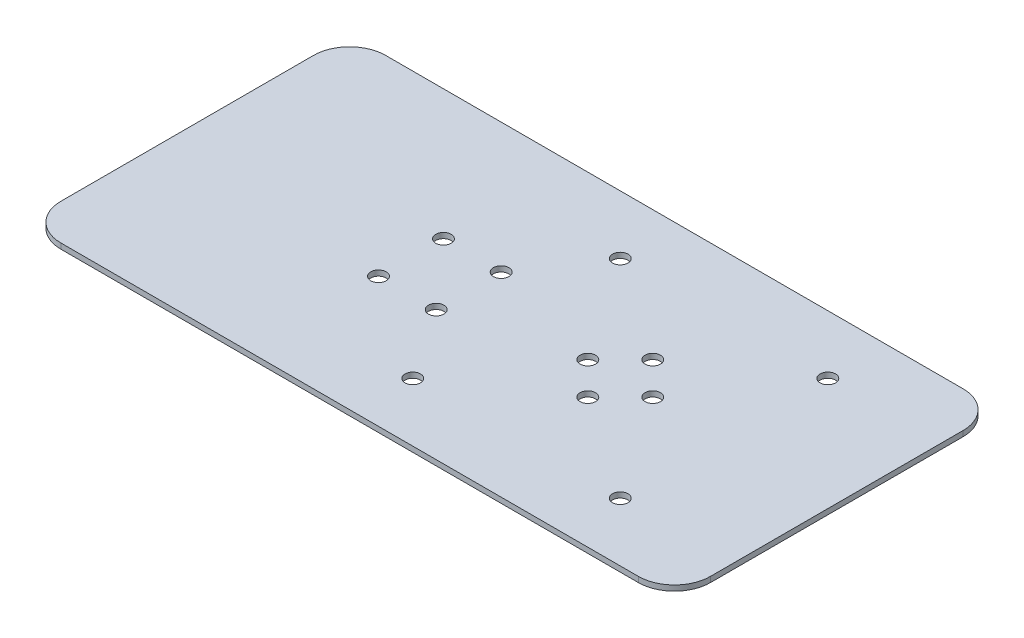
ISO-10303-21;
HEADER;
FILE_DESCRIPTION(('STEP AP214'),'2;1');
FILE_NAME('part.step','',(''),(''),'','','');
FILE_SCHEMA(('AUTOMOTIVE_DESIGN { 1 0 10303 214 1 1 1 1 }'));
ENDSEC;
DATA;
#1=APPLICATION_CONTEXT('core data for automotive mechanical design processes');
#2=APPLICATION_PROTOCOL_DEFINITION('international standard','automotive_design',2000,#1);
#3=PRODUCT_CONTEXT('',#1,'mechanical');
#4=PRODUCT('Part','Part','',(#3));
#5=PRODUCT_RELATED_PRODUCT_CATEGORY('part','',(#4));
#6=PRODUCT_DEFINITION_FORMATION('','',#4);
#7=PRODUCT_DEFINITION_CONTEXT('part definition',#1,'design');
#8=PRODUCT_DEFINITION('design','',#6,#7);
#9=PRODUCT_DEFINITION_SHAPE('','',#8);
#10=(LENGTH_UNIT() NAMED_UNIT(*) SI_UNIT(.MILLI.,.METRE.));
#11=(NAMED_UNIT(*) PLANE_ANGLE_UNIT() SI_UNIT($,.RADIAN.));
#12=(NAMED_UNIT(*) SI_UNIT($,.STERADIAN.) SOLID_ANGLE_UNIT());
#13=UNCERTAINTY_MEASURE_WITH_UNIT(LENGTH_MEASURE(1.E-05),#10,'distance_accuracy_value','');
#14=(GEOMETRIC_REPRESENTATION_CONTEXT(3) GLOBAL_UNCERTAINTY_ASSIGNED_CONTEXT((#13)) GLOBAL_UNIT_ASSIGNED_CONTEXT((#10,
#11,#12)) REPRESENTATION_CONTEXT('',''));
#15=CARTESIAN_POINT('',(0.,0.,0.));
#16=DIRECTION('',(0.,0.,1.));
#17=DIRECTION('',(1.,0.,0.));
#18=AXIS2_PLACEMENT_3D('',#15,#16,#17);
#19=CARTESIAN_POINT('',(0.,1.5,0.));
#20=DIRECTION('',(1.,0.,0.));
#21=DIRECTION('',(0.,0.,-1.));
#22=AXIS2_PLACEMENT_3D('',#19,#20,#21);
#23=PLANE('',#22);
#24=DIRECTION('',(0.,0.,1.));
#25=VECTOR('',#24,1.);
#26=CARTESIAN_POINT('',(0.,1.5,0.));
#27=LINE('',#26,#25);
#28=CARTESIAN_POINT('',(0.,1.5,25.));
#29=VERTEX_POINT('',#28);
#30=CARTESIAN_POINT('',(0.,1.5,95.));
#31=VERTEX_POINT('',#30);
#32=EDGE_CURVE('E249',#29,#31,#27,.T.);
#33=ORIENTED_EDGE('',*,*,#32,.F.);
#34=DIRECTION('',(0.,1.,0.));
#35=VECTOR('',#34,1.);
#36=CARTESIAN_POINT('',(0.,1.5,25.));
#37=LINE('',#36,#35);
#38=CARTESIAN_POINT('',(0.,0.,25.));
#39=VERTEX_POINT('',#38);
#40=EDGE_CURVE('E117',#29,#39,#37,.F.);
#41=ORIENTED_EDGE('',*,*,#40,.T.);
#42=DIRECTION('',(0.,0.,1.));
#43=VECTOR('',#42,1.);
#44=CARTESIAN_POINT('',(0.,0.,0.));
#45=LINE('',#44,#43);
#46=CARTESIAN_POINT('',(0.,0.,95.));
#47=VERTEX_POINT('',#46);
#48=EDGE_CURVE('E245',#39,#47,#45,.T.);
#49=ORIENTED_EDGE('',*,*,#48,.T.);
#50=DIRECTION('',(0.,1.,0.));
#51=VECTOR('',#50,1.);
#52=CARTESIAN_POINT('',(0.,1.5,95.));
#53=LINE('',#52,#51);
#54=EDGE_CURVE('E123',#47,#31,#53,.T.);
#55=ORIENTED_EDGE('',*,*,#54,.T.);
#56=EDGE_LOOP('',(#33,#41,#49,#55));
#57=FACE_BOUND('',#56,.T.);
#58=ADVANCED_FACE('F45',(#57),#23,.F.);
#59=CARTESIAN_POINT('',(180.,1.5,0.));
#60=DIRECTION('',(-1.,0.,0.));
#61=DIRECTION('',(0.,0.,1.));
#62=AXIS2_PLACEMENT_3D('',#59,#60,#61);
#63=PLANE('',#62);
#64=DIRECTION('',(0.,0.,-1.));
#65=VECTOR('',#64,1.);
#66=CARTESIAN_POINT('',(180.,0.,0.));
#67=LINE('',#66,#65);
#68=CARTESIAN_POINT('',(180.,0.,95.));
#69=VERTEX_POINT('',#68);
#70=CARTESIAN_POINT('',(180.,0.,25.));
#71=VERTEX_POINT('',#70);
#72=EDGE_CURVE('E253',#69,#71,#67,.T.);
#73=ORIENTED_EDGE('',*,*,#72,.T.);
#74=DIRECTION('',(0.,1.,0.));
#75=VECTOR('',#74,1.);
#76=CARTESIAN_POINT('',(180.,1.5,25.));
#77=LINE('',#76,#75);
#78=CARTESIAN_POINT('',(180.,1.5,25.));
#79=VERTEX_POINT('',#78);
#80=EDGE_CURVE('E290',#71,#79,#77,.T.);
#81=ORIENTED_EDGE('',*,*,#80,.T.);
#82=DIRECTION('',(0.,0.,-1.));
#83=VECTOR('',#82,1.);
#84=CARTESIAN_POINT('',(180.,1.5,0.));
#85=LINE('',#84,#83);
#86=CARTESIAN_POINT('',(180.,1.5,95.));
#87=VERTEX_POINT('',#86);
#88=EDGE_CURVE('E252',#87,#79,#85,.T.);
#89=ORIENTED_EDGE('',*,*,#88,.F.);
#90=DIRECTION('',(0.,1.,0.));
#91=VECTOR('',#90,1.);
#92=CARTESIAN_POINT('',(180.,1.5,95.));
#93=LINE('',#92,#91);
#94=EDGE_CURVE('E287',#87,#69,#93,.F.);
#95=ORIENTED_EDGE('',*,*,#94,.T.);
#96=EDGE_LOOP('',(#73,#81,#89,#95));
#97=FACE_BOUND('',#96,.T.);
#98=ADVANCED_FACE('F297',(#97),#63,.F.);
#99=CARTESIAN_POINT('',(0.,1.5,0.));
#100=DIRECTION('',(0.,1.,0.));
#101=DIRECTION('',(0.,0.,1.));
#102=AXIS2_PLACEMENT_3D('',#99,#100,#101);
#103=PLANE('',#102);
#104=DIRECTION('',(1.,0.,0.));
#105=VECTOR('',#104,1.);
#106=CARTESIAN_POINT('',(0.,1.5,15.));
#107=LINE('',#106,#105);
#108=CARTESIAN_POINT('',(10.,1.5,15.));
#109=VERTEX_POINT('',#108);
#110=CARTESIAN_POINT('',(170.,1.5,15.));
#111=VERTEX_POINT('',#110);
#112=EDGE_CURVE('E130',#109,#111,#107,.T.);
#113=ORIENTED_EDGE('',*,*,#112,.F.);
#114=CARTESIAN_POINT('',(10.,1.5,25.));
#115=DIRECTION('',(0.,1.,0.));
#116=DIRECTION('',(0.,0.,1.));
#117=AXIS2_PLACEMENT_3D('',#114,#115,#116);
#118=CIRCLE('',#117,10.);
#119=EDGE_CURVE('E112',#109,#29,#118,.T.);
#120=ORIENTED_EDGE('',*,*,#119,.T.);
#121=ORIENTED_EDGE('',*,*,#32,.T.);
#122=CARTESIAN_POINT('',(10.,1.5,95.));
#123=DIRECTION('',(0.,1.,0.));
#124=DIRECTION('',(0.,0.,1.));
#125=AXIS2_PLACEMENT_3D('',#122,#123,#124);
#126=CIRCLE('',#125,10.);
#127=CARTESIAN_POINT('',(10.,1.5,105.));
#128=VERTEX_POINT('',#127);
#129=EDGE_CURVE('E135',#31,#128,#126,.T.);
#130=ORIENTED_EDGE('',*,*,#129,.T.);
#131=DIRECTION('',(-1.,0.,0.));
#132=VECTOR('',#131,1.);
#133=CARTESIAN_POINT('',(0.,1.5,105.));
#134=LINE('',#133,#132);
#135=CARTESIAN_POINT('',(170.,1.5,105.));
#136=VERTEX_POINT('',#135);
#137=EDGE_CURVE('E142',#136,#128,#134,.T.);
#138=ORIENTED_EDGE('',*,*,#137,.F.);
#139=CARTESIAN_POINT('',(170.,1.5,95.));
#140=DIRECTION('',(0.,1.,0.));
#141=DIRECTION('',(0.,0.,1.));
#142=AXIS2_PLACEMENT_3D('',#139,#140,#141);
#143=CIRCLE('',#142,10.);
#144=EDGE_CURVE('E266',#136,#87,#143,.T.);
#145=ORIENTED_EDGE('',*,*,#144,.T.);
#146=ORIENTED_EDGE('',*,*,#88,.T.);
#147=CARTESIAN_POINT('',(170.,1.5,25.));
#148=DIRECTION('',(0.,1.,0.));
#149=DIRECTION('',(0.,0.,1.));
#150=AXIS2_PLACEMENT_3D('',#147,#148,#149);
#151=CIRCLE('',#150,10.);
#152=EDGE_CURVE('E124',#79,#111,#151,.T.);
#153=ORIENTED_EDGE('',*,*,#152,.T.);
#154=EDGE_LOOP('',(#113,#120,#121,#130,#138,#145,#146,#153));
#155=FACE_BOUND('',#154,.T.);
#156=CARTESIAN_POINT('',(78.,1.5,51.));
#157=DIRECTION('',(0.,1.,0.));
#158=DIRECTION('',(0.,0.,1.));
#159=AXIS2_PLACEMENT_3D('',#156,#157,#158);
#160=CIRCLE('',#159,2.15);
#161=CARTESIAN_POINT('',(78.,1.5,53.15));
#162=VERTEX_POINT('',#161);
#163=EDGE_CURVE('E193',#162,#162,#160,.T.);
#164=ORIENTED_EDGE('',*,*,#163,.F.);
#165=EDGE_LOOP('',(#164));
#166=FACE_BOUND('',#165,.T.);
#167=CARTESIAN_POINT('',(62.,1.5,69.));
#168=DIRECTION('',(0.,1.,0.));
#169=DIRECTION('',(0.,0.,1.));
#170=AXIS2_PLACEMENT_3D('',#167,#168,#169);
#171=CIRCLE('',#170,2.15);
#172=CARTESIAN_POINT('',(62.,1.5,71.15));
#173=VERTEX_POINT('',#172);
#174=EDGE_CURVE('E202',#173,#173,#171,.T.);
#175=ORIENTED_EDGE('',*,*,#174,.F.);
#176=EDGE_LOOP('',(#175));
#177=FACE_BOUND('',#176,.T.);
#178=CARTESIAN_POINT('',(78.,1.5,69.));
#179=DIRECTION('',(0.,1.,0.));
#180=DIRECTION('',(0.,0.,1.));
#181=AXIS2_PLACEMENT_3D('',#178,#179,#180);
#182=CIRCLE('',#181,2.15);
#183=CARTESIAN_POINT('',(78.,1.5,71.15));
#184=VERTEX_POINT('',#183);
#185=EDGE_CURVE('E177',#184,#184,#182,.T.);
#186=ORIENTED_EDGE('',*,*,#185,.F.);
#187=EDGE_LOOP('',(#186));
#188=FACE_BOUND('',#187,.T.);
#189=CARTESIAN_POINT('',(91.25,1.5,31.25));
#190=DIRECTION('',(0.,1.,0.));
#191=DIRECTION('',(0.,0.,1.));
#192=AXIS2_PLACEMENT_3D('',#189,#190,#191);
#193=CIRCLE('',#192,2.15);
#194=CARTESIAN_POINT('',(91.25,1.5,33.4));
#195=VERTEX_POINT('',#194);
#196=EDGE_CURVE('E186',#195,#195,#193,.T.);
#197=ORIENTED_EDGE('',*,*,#196,.F.);
#198=EDGE_LOOP('',(#197));
#199=FACE_BOUND('',#198,.T.);
#200=CARTESIAN_POINT('',(62.,1.5,51.));
#201=DIRECTION('',(0.,1.,0.));
#202=DIRECTION('',(0.,0.,1.));
#203=AXIS2_PLACEMENT_3D('',#200,#201,#202);
#204=CIRCLE('',#203,2.15000000000002);
#205=CARTESIAN_POINT('',(62.,1.5,53.15));
#206=VERTEX_POINT('',#205);
#207=EDGE_CURVE('E234',#206,#206,#204,.T.);
#208=ORIENTED_EDGE('',*,*,#207,.F.);
#209=EDGE_LOOP('',(#208));
#210=FACE_BOUND('',#209,.T.);
#211=CARTESIAN_POINT('',(111.,1.5,60.));
#212=DIRECTION('',(0.,1.,0.));
#213=DIRECTION('',(0.,0.,1.));
#214=AXIS2_PLACEMENT_3D('',#211,#212,#213);
#215=CIRCLE('',#214,2.15);
#216=CARTESIAN_POINT('',(111.,1.5,62.15));
#217=VERTEX_POINT('',#216);
#218=EDGE_CURVE('E226',#217,#217,#215,.T.);
#219=ORIENTED_EDGE('',*,*,#218,.F.);
#220=EDGE_LOOP('',(#219));
#221=FACE_BOUND('',#220,.T.);
#222=CARTESIAN_POINT('',(129.,1.5,60.));
#223=DIRECTION('',(0.,1.,0.));
#224=DIRECTION('',(0.,0.,1.));
#225=AXIS2_PLACEMENT_3D('',#222,#223,#224);
#226=CIRCLE('',#225,2.15000000000002);
#227=CARTESIAN_POINT('',(129.,1.5,62.15));
#228=VERTEX_POINT('',#227);
#229=EDGE_CURVE('E218',#228,#228,#226,.T.);
#230=ORIENTED_EDGE('',*,*,#229,.F.);
#231=EDGE_LOOP('',(#230));
#232=FACE_BOUND('',#231,.T.);
#233=CARTESIAN_POINT('',(120.,1.5,69.));
#234=DIRECTION('',(0.,1.,0.));
#235=DIRECTION('',(0.,0.,1.));
#236=AXIS2_PLACEMENT_3D('',#233,#234,#235);
#237=CIRCLE('',#236,2.15);
#238=CARTESIAN_POINT('',(120.,1.5,71.15));
#239=VERTEX_POINT('',#238);
#240=EDGE_CURVE('E209',#239,#239,#237,.T.);
#241=ORIENTED_EDGE('',*,*,#240,.F.);
#242=EDGE_LOOP('',(#241));
#243=FACE_BOUND('',#242,.T.);
#244=CARTESIAN_POINT('',(91.25,1.5,88.75));
#245=DIRECTION('',(0.,1.,0.));
#246=DIRECTION('',(0.,0.,1.));
#247=AXIS2_PLACEMENT_3D('',#244,#245,#246);
#248=CIRCLE('',#247,2.15);
#249=CARTESIAN_POINT('',(91.25,1.5,90.9));
#250=VERTEX_POINT('',#249);
#251=EDGE_CURVE('E153',#250,#250,#248,.T.);
#252=ORIENTED_EDGE('',*,*,#251,.F.);
#253=EDGE_LOOP('',(#252));
#254=FACE_BOUND('',#253,.T.);
#255=CARTESIAN_POINT('',(148.75,1.5,88.75));
#256=DIRECTION('',(0.,1.,0.));
#257=DIRECTION('',(0.,0.,1.));
#258=AXIS2_PLACEMENT_3D('',#255,#256,#257);
#259=CIRCLE('',#258,2.15000000000001);
#260=CARTESIAN_POINT('',(148.75,1.5,90.9));
#261=VERTEX_POINT('',#260);
#262=EDGE_CURVE('E162',#261,#261,#259,.T.);
#263=ORIENTED_EDGE('',*,*,#262,.F.);
#264=EDGE_LOOP('',(#263));
#265=FACE_BOUND('',#264,.T.);
#266=CARTESIAN_POINT('',(148.75,1.5,31.25));
#267=DIRECTION('',(0.,1.,0.));
#268=DIRECTION('',(0.,0.,1.));
#269=AXIS2_PLACEMENT_3D('',#266,#267,#268);
#270=CIRCLE('',#269,2.15000000000002);
#271=CARTESIAN_POINT('',(148.75,1.5,33.4));
#272=VERTEX_POINT('',#271);
#273=EDGE_CURVE('E170',#272,#272,#270,.T.);
#274=ORIENTED_EDGE('',*,*,#273,.F.);
#275=EDGE_LOOP('',(#274));
#276=FACE_BOUND('',#275,.T.);
#277=CARTESIAN_POINT('',(120.,1.5,51.));
#278=DIRECTION('',(0.,1.,0.));
#279=DIRECTION('',(0.,0.,1.));
#280=AXIS2_PLACEMENT_3D('',#277,#278,#279);
#281=CIRCLE('',#280,2.15);
#282=CARTESIAN_POINT('',(120.,1.5,53.15));
#283=VERTEX_POINT('',#282);
#284=EDGE_CURVE('E213',#283,#283,#281,.T.);
#285=ORIENTED_EDGE('',*,*,#284,.F.);
#286=EDGE_LOOP('',(#285));
#287=FACE_BOUND('',#286,.T.);
#288=ADVANCED_FACE('F138',(#155,#166,#177,#188,#199,#210,#221,#232,#243,#254,#265,#276,#287),
#103,.T.);
#289=CARTESIAN_POINT('',(0.,0.,0.));
#290=DIRECTION('',(0.,1.,0.));
#291=DIRECTION('',(0.,0.,1.));
#292=AXIS2_PLACEMENT_3D('',#289,#290,#291);
#293=PLANE('',#292);
#294=CARTESIAN_POINT('',(78.,0.,51.));
#295=DIRECTION('',(0.,1.,0.));
#296=DIRECTION('',(0.,0.,1.));
#297=AXIS2_PLACEMENT_3D('',#294,#295,#296);
#298=CIRCLE('',#297,2.15);
#299=CARTESIAN_POINT('',(78.,0.,53.15));
#300=VERTEX_POINT('',#299);
#301=EDGE_CURVE('E198',#300,#300,#298,.T.);
#302=ORIENTED_EDGE('',*,*,#301,.T.);
#303=EDGE_LOOP('',(#302));
#304=FACE_BOUND('',#303,.T.);
#305=CARTESIAN_POINT('',(62.,0.,69.));
#306=DIRECTION('',(0.,1.,0.));
#307=DIRECTION('',(0.,0.,1.));
#308=AXIS2_PLACEMENT_3D('',#305,#306,#307);
#309=CIRCLE('',#308,2.15);
#310=CARTESIAN_POINT('',(62.,0.,71.15));
#311=VERTEX_POINT('',#310);
#312=EDGE_CURVE('E181',#311,#311,#309,.T.);
#313=ORIENTED_EDGE('',*,*,#312,.T.);
#314=EDGE_LOOP('',(#313));
#315=FACE_BOUND('',#314,.T.);
#316=CARTESIAN_POINT('',(78.,0.,69.));
#317=DIRECTION('',(0.,1.,0.));
#318=DIRECTION('',(0.,0.,1.));
#319=AXIS2_PLACEMENT_3D('',#316,#317,#318);
#320=CIRCLE('',#319,2.15);
#321=CARTESIAN_POINT('',(78.,0.,71.15));
#322=VERTEX_POINT('',#321);
#323=EDGE_CURVE('E182',#322,#322,#320,.T.);
#324=ORIENTED_EDGE('',*,*,#323,.T.);
#325=EDGE_LOOP('',(#324));
#326=FACE_BOUND('',#325,.T.);
#327=CARTESIAN_POINT('',(91.25,0.,31.25));
#328=DIRECTION('',(0.,1.,0.));
#329=DIRECTION('',(0.,0.,1.));
#330=AXIS2_PLACEMENT_3D('',#327,#328,#329);
#331=CIRCLE('',#330,2.15);
#332=CARTESIAN_POINT('',(91.25,0.,33.4));
#333=VERTEX_POINT('',#332);
#334=EDGE_CURVE('E157',#333,#333,#331,.T.);
#335=ORIENTED_EDGE('',*,*,#334,.T.);
#336=EDGE_LOOP('',(#335));
#337=FACE_BOUND('',#336,.T.);
#338=CARTESIAN_POINT('',(62.,0.,51.));
#339=DIRECTION('',(0.,1.,0.));
#340=DIRECTION('',(0.,0.,1.));
#341=AXIS2_PLACEMENT_3D('',#338,#339,#340);
#342=CIRCLE('',#341,2.15000000000002);
#343=CARTESIAN_POINT('',(62.,0.,53.15));
#344=VERTEX_POINT('',#343);
#345=EDGE_CURVE('E197',#344,#344,#342,.T.);
#346=ORIENTED_EDGE('',*,*,#345,.T.);
#347=EDGE_LOOP('',(#346));
#348=FACE_BOUND('',#347,.T.);
#349=CARTESIAN_POINT('',(111.,0.,60.));
#350=DIRECTION('',(0.,1.,0.));
#351=DIRECTION('',(0.,0.,1.));
#352=AXIS2_PLACEMENT_3D('',#349,#350,#351);
#353=CIRCLE('',#352,2.15);
#354=CARTESIAN_POINT('',(111.,0.,62.15));
#355=VERTEX_POINT('',#354);
#356=EDGE_CURVE('E230',#355,#355,#353,.T.);
#357=ORIENTED_EDGE('',*,*,#356,.T.);
#358=EDGE_LOOP('',(#357));
#359=FACE_BOUND('',#358,.T.);
#360=CARTESIAN_POINT('',(129.,0.,60.));
#361=DIRECTION('',(0.,1.,0.));
#362=DIRECTION('',(0.,0.,1.));
#363=AXIS2_PLACEMENT_3D('',#360,#361,#362);
#364=CIRCLE('',#363,2.15000000000002);
#365=CARTESIAN_POINT('',(129.,0.,62.15));
#366=VERTEX_POINT('',#365);
#367=EDGE_CURVE('E222',#366,#366,#364,.T.);
#368=ORIENTED_EDGE('',*,*,#367,.T.);
#369=EDGE_LOOP('',(#368));
#370=FACE_BOUND('',#369,.T.);
#371=CARTESIAN_POINT('',(120.,0.,69.));
#372=DIRECTION('',(0.,1.,0.));
#373=DIRECTION('',(0.,0.,1.));
#374=AXIS2_PLACEMENT_3D('',#371,#372,#373);
#375=CIRCLE('',#374,2.15);
#376=CARTESIAN_POINT('',(120.,0.,71.15));
#377=VERTEX_POINT('',#376);
#378=EDGE_CURVE('E214',#377,#377,#375,.T.);
#379=ORIENTED_EDGE('',*,*,#378,.T.);
#380=EDGE_LOOP('',(#379));
#381=FACE_BOUND('',#380,.T.);
#382=CARTESIAN_POINT('',(91.25,0.,88.75));
#383=DIRECTION('',(0.,1.,0.));
#384=DIRECTION('',(0.,0.,1.));
#385=AXIS2_PLACEMENT_3D('',#382,#383,#384);
#386=CIRCLE('',#385,2.15);
#387=CARTESIAN_POINT('',(91.25,0.,90.9));
#388=VERTEX_POINT('',#387);
#389=EDGE_CURVE('E158',#388,#388,#386,.T.);
#390=ORIENTED_EDGE('',*,*,#389,.T.);
#391=EDGE_LOOP('',(#390));
#392=FACE_BOUND('',#391,.T.);
#393=CARTESIAN_POINT('',(148.75,0.,88.75));
#394=DIRECTION('',(0.,1.,0.));
#395=DIRECTION('',(0.,0.,1.));
#396=AXIS2_PLACEMENT_3D('',#393,#394,#395);
#397=CIRCLE('',#396,2.15000000000001);
#398=CARTESIAN_POINT('',(148.75,0.,90.9));
#399=VERTEX_POINT('',#398);
#400=EDGE_CURVE('E166',#399,#399,#397,.T.);
#401=ORIENTED_EDGE('',*,*,#400,.T.);
#402=EDGE_LOOP('',(#401));
#403=FACE_BOUND('',#402,.T.);
#404=CARTESIAN_POINT('',(148.75,0.,31.25));
#405=DIRECTION('',(0.,1.,0.));
#406=DIRECTION('',(0.,0.,1.));
#407=AXIS2_PLACEMENT_3D('',#404,#405,#406);
#408=CIRCLE('',#407,2.15000000000002);
#409=CARTESIAN_POINT('',(148.75,0.,33.4));
#410=VERTEX_POINT('',#409);
#411=EDGE_CURVE('E146',#410,#410,#408,.T.);
#412=ORIENTED_EDGE('',*,*,#411,.T.);
#413=EDGE_LOOP('',(#412));
#414=FACE_BOUND('',#413,.T.);
#415=CARTESIAN_POINT('',(120.,0.,51.));
#416=DIRECTION('',(0.,1.,0.));
#417=DIRECTION('',(0.,0.,1.));
#418=AXIS2_PLACEMENT_3D('',#415,#416,#417);
#419=CIRCLE('',#418,2.15);
#420=CARTESIAN_POINT('',(120.,0.,53.15));
#421=VERTEX_POINT('',#420);
#422=EDGE_CURVE('E241',#421,#421,#419,.T.);
#423=ORIENTED_EDGE('',*,*,#422,.T.);
#424=EDGE_LOOP('',(#423));
#425=FACE_BOUND('',#424,.T.);
#426=ORIENTED_EDGE('',*,*,#48,.F.);
#427=CARTESIAN_POINT('',(10.,0.,25.));
#428=DIRECTION('',(0.,1.,0.));
#429=DIRECTION('',(0.,0.,1.));
#430=AXIS2_PLACEMENT_3D('',#427,#428,#429);
#431=CIRCLE('',#430,10.);
#432=CARTESIAN_POINT('',(10.,0.,15.));
#433=VERTEX_POINT('',#432);
#434=EDGE_CURVE('E284',#39,#433,#431,.F.);
#435=ORIENTED_EDGE('',*,*,#434,.T.);
#436=DIRECTION('',(1.,0.,0.));
#437=VECTOR('',#436,1.);
#438=CARTESIAN_POINT('',(0.,0.,15.));
#439=LINE('',#438,#437);
#440=CARTESIAN_POINT('',(170.,0.,15.));
#441=VERTEX_POINT('',#440);
#442=EDGE_CURVE('E133',#433,#441,#439,.T.);
#443=ORIENTED_EDGE('',*,*,#442,.T.);
#444=CARTESIAN_POINT('',(170.,0.,25.));
#445=DIRECTION('',(0.,1.,0.));
#446=DIRECTION('',(0.,0.,1.));
#447=AXIS2_PLACEMENT_3D('',#444,#445,#446);
#448=CIRCLE('',#447,10.);
#449=EDGE_CURVE('E281',#441,#71,#448,.F.);
#450=ORIENTED_EDGE('',*,*,#449,.T.);
#451=ORIENTED_EDGE('',*,*,#72,.F.);
#452=CARTESIAN_POINT('',(170.,0.,95.));
#453=DIRECTION('',(0.,1.,0.));
#454=DIRECTION('',(0.,0.,1.));
#455=AXIS2_PLACEMENT_3D('',#452,#453,#454);
#456=CIRCLE('',#455,10.);
#457=CARTESIAN_POINT('',(170.,0.,105.));
#458=VERTEX_POINT('',#457);
#459=EDGE_CURVE('E67',#69,#458,#456,.F.);
#460=ORIENTED_EDGE('',*,*,#459,.T.);
#461=DIRECTION('',(-1.,0.,0.));
#462=VECTOR('',#461,1.);
#463=CARTESIAN_POINT('',(0.,0.,105.));
#464=LINE('',#463,#462);
#465=CARTESIAN_POINT('',(10.,0.,105.));
#466=VERTEX_POINT('',#465);
#467=EDGE_CURVE('E148',#458,#466,#464,.T.);
#468=ORIENTED_EDGE('',*,*,#467,.T.);
#469=CARTESIAN_POINT('',(10.,0.,95.));
#470=DIRECTION('',(0.,1.,0.));
#471=DIRECTION('',(0.,0.,1.));
#472=AXIS2_PLACEMENT_3D('',#469,#470,#471);
#473=CIRCLE('',#472,10.);
#474=EDGE_CURVE('E276',#466,#47,#473,.F.);
#475=ORIENTED_EDGE('',*,*,#474,.T.);
#476=EDGE_LOOP('',(#426,#435,#443,#450,#451,#460,#468,#475));
#477=FACE_BOUND('',#476,.T.);
#478=ADVANCED_FACE('F308',(#304,#315,#326,#337,#348,#359,#370,#381,#392,#403,#414,#425,#477),
#293,.F.);
#479=CARTESIAN_POINT('',(120.,0.,51.));
#480=DIRECTION('',(0.,1.,0.));
#481=DIRECTION('',(0.,0.,1.));
#482=AXIS2_PLACEMENT_3D('',#479,#480,#481);
#483=CYLINDRICAL_SURFACE('',#482,2.15);
#484=ORIENTED_EDGE('',*,*,#422,.F.);
#485=EDGE_LOOP('',(#484));
#486=FACE_BOUND('',#485,.T.);
#487=ORIENTED_EDGE('',*,*,#284,.T.);
#488=EDGE_LOOP('',(#487));
#489=FACE_BOUND('',#488,.T.);
#490=ADVANCED_FACE('F330',(#486,#489),#483,.F.);
#491=CARTESIAN_POINT('',(148.75,0.,31.25));
#492=DIRECTION('',(0.,1.,0.));
#493=DIRECTION('',(0.,0.,1.));
#494=AXIS2_PLACEMENT_3D('',#491,#492,#493);
#495=CYLINDRICAL_SURFACE('',#494,2.15000000000002);
#496=ORIENTED_EDGE('',*,*,#411,.F.);
#497=EDGE_LOOP('',(#496));
#498=FACE_BOUND('',#497,.T.);
#499=ORIENTED_EDGE('',*,*,#273,.T.);
#500=EDGE_LOOP('',(#499));
#501=FACE_BOUND('',#500,.T.);
#502=ADVANCED_FACE('F336',(#498,#501),#495,.F.);
#503=CARTESIAN_POINT('',(148.75,0.,88.75));
#504=DIRECTION('',(0.,1.,0.));
#505=DIRECTION('',(0.,0.,1.));
#506=AXIS2_PLACEMENT_3D('',#503,#504,#505);
#507=CYLINDRICAL_SURFACE('',#506,2.15000000000001);
#508=ORIENTED_EDGE('',*,*,#400,.F.);
#509=EDGE_LOOP('',(#508));
#510=FACE_BOUND('',#509,.T.);
#511=ORIENTED_EDGE('',*,*,#262,.T.);
#512=EDGE_LOOP('',(#511));
#513=FACE_BOUND('',#512,.T.);
#514=ADVANCED_FACE('F372',(#510,#513),#507,.F.);
#515=CARTESIAN_POINT('',(91.25,0.,88.75));
#516=DIRECTION('',(0.,1.,0.));
#517=DIRECTION('',(0.,0.,1.));
#518=AXIS2_PLACEMENT_3D('',#515,#516,#517);
#519=CYLINDRICAL_SURFACE('',#518,2.15);
#520=ORIENTED_EDGE('',*,*,#389,.F.);
#521=EDGE_LOOP('',(#520));
#522=FACE_BOUND('',#521,.T.);
#523=ORIENTED_EDGE('',*,*,#251,.T.);
#524=EDGE_LOOP('',(#523));
#525=FACE_BOUND('',#524,.T.);
#526=ADVANCED_FACE('F354',(#522,#525),#519,.F.);
#527=CARTESIAN_POINT('',(120.,0.,69.));
#528=DIRECTION('',(0.,1.,0.));
#529=DIRECTION('',(0.,0.,1.));
#530=AXIS2_PLACEMENT_3D('',#527,#528,#529);
#531=CYLINDRICAL_SURFACE('',#530,2.15);
#532=ORIENTED_EDGE('',*,*,#378,.F.);
#533=EDGE_LOOP('',(#532));
#534=FACE_BOUND('',#533,.T.);
#535=ORIENTED_EDGE('',*,*,#240,.T.);
#536=EDGE_LOOP('',(#535));
#537=FACE_BOUND('',#536,.T.);
#538=ADVANCED_FACE('F350',(#534,#537),#531,.F.);
#539=CARTESIAN_POINT('',(129.,0.,60.));
#540=DIRECTION('',(0.,1.,0.));
#541=DIRECTION('',(0.,0.,1.));
#542=AXIS2_PLACEMENT_3D('',#539,#540,#541);
#543=CYLINDRICAL_SURFACE('',#542,2.15000000000002);
#544=ORIENTED_EDGE('',*,*,#367,.F.);
#545=EDGE_LOOP('',(#544));
#546=FACE_BOUND('',#545,.T.);
#547=ORIENTED_EDGE('',*,*,#229,.T.);
#548=EDGE_LOOP('',(#547));
#549=FACE_BOUND('',#548,.T.);
#550=ADVANCED_FACE('F346',(#546,#549),#543,.F.);
#551=CARTESIAN_POINT('',(111.,0.,60.));
#552=DIRECTION('',(0.,1.,0.));
#553=DIRECTION('',(0.,0.,1.));
#554=AXIS2_PLACEMENT_3D('',#551,#552,#553);
#555=CYLINDRICAL_SURFACE('',#554,2.15);
#556=ORIENTED_EDGE('',*,*,#356,.F.);
#557=EDGE_LOOP('',(#556));
#558=FACE_BOUND('',#557,.T.);
#559=ORIENTED_EDGE('',*,*,#218,.T.);
#560=EDGE_LOOP('',(#559));
#561=FACE_BOUND('',#560,.T.);
#562=ADVANCED_FACE('F342',(#558,#561),#555,.F.);
#563=CARTESIAN_POINT('',(62.,0.,51.));
#564=DIRECTION('',(0.,1.,0.));
#565=DIRECTION('',(0.,0.,1.));
#566=AXIS2_PLACEMENT_3D('',#563,#564,#565);
#567=CYLINDRICAL_SURFACE('',#566,2.15000000000002);
#568=ORIENTED_EDGE('',*,*,#345,.F.);
#569=EDGE_LOOP('',(#568));
#570=FACE_BOUND('',#569,.T.);
#571=ORIENTED_EDGE('',*,*,#207,.T.);
#572=EDGE_LOOP('',(#571));
#573=FACE_BOUND('',#572,.T.);
#574=ADVANCED_FACE('F338',(#570,#573),#567,.F.);
#575=CARTESIAN_POINT('',(91.25,0.,31.25));
#576=DIRECTION('',(0.,1.,0.));
#577=DIRECTION('',(0.,0.,1.));
#578=AXIS2_PLACEMENT_3D('',#575,#576,#577);
#579=CYLINDRICAL_SURFACE('',#578,2.15);
#580=ORIENTED_EDGE('',*,*,#334,.F.);
#581=EDGE_LOOP('',(#580));
#582=FACE_BOUND('',#581,.T.);
#583=ORIENTED_EDGE('',*,*,#196,.T.);
#584=EDGE_LOOP('',(#583));
#585=FACE_BOUND('',#584,.T.);
#586=ADVANCED_FACE('F341',(#582,#585),#579,.F.);
#587=CARTESIAN_POINT('',(78.,0.,69.));
#588=DIRECTION('',(0.,1.,0.));
#589=DIRECTION('',(0.,0.,1.));
#590=AXIS2_PLACEMENT_3D('',#587,#588,#589);
#591=CYLINDRICAL_SURFACE('',#590,2.15);
#592=ORIENTED_EDGE('',*,*,#323,.F.);
#593=EDGE_LOOP('',(#592));
#594=FACE_BOUND('',#593,.T.);
#595=ORIENTED_EDGE('',*,*,#185,.T.);
#596=EDGE_LOOP('',(#595));
#597=FACE_BOUND('',#596,.T.);
#598=ADVANCED_FACE('F360',(#594,#597),#591,.F.);
#599=CARTESIAN_POINT('',(62.,0.,69.));
#600=DIRECTION('',(0.,1.,0.));
#601=DIRECTION('',(0.,0.,1.));
#602=AXIS2_PLACEMENT_3D('',#599,#600,#601);
#603=CYLINDRICAL_SURFACE('',#602,2.15);
#604=ORIENTED_EDGE('',*,*,#312,.F.);
#605=EDGE_LOOP('',(#604));
#606=FACE_BOUND('',#605,.T.);
#607=ORIENTED_EDGE('',*,*,#174,.T.);
#608=EDGE_LOOP('',(#607));
#609=FACE_BOUND('',#608,.T.);
#610=ADVANCED_FACE('F356',(#606,#609),#603,.F.);
#611=CARTESIAN_POINT('',(78.,0.,51.));
#612=DIRECTION('',(0.,1.,0.));
#613=DIRECTION('',(0.,0.,1.));
#614=AXIS2_PLACEMENT_3D('',#611,#612,#613);
#615=CYLINDRICAL_SURFACE('',#614,2.15);
#616=ORIENTED_EDGE('',*,*,#301,.F.);
#617=EDGE_LOOP('',(#616));
#618=FACE_BOUND('',#617,.T.);
#619=ORIENTED_EDGE('',*,*,#163,.T.);
#620=EDGE_LOOP('',(#619));
#621=FACE_BOUND('',#620,.T.);
#622=ADVANCED_FACE('F359',(#618,#621),#615,.F.);
#623=CARTESIAN_POINT('',(0.,0.,105.));
#624=DIRECTION('',(0.,0.,-1.));
#625=DIRECTION('',(-1.,0.,0.));
#626=AXIS2_PLACEMENT_3D('',#623,#624,#625);
#627=PLANE('',#626);
#628=ORIENTED_EDGE('',*,*,#467,.F.);
#629=DIRECTION('',(0.,1.,0.));
#630=VECTOR('',#629,1.);
#631=CARTESIAN_POINT('',(170.,0.,105.));
#632=LINE('',#631,#630);
#633=EDGE_CURVE('E11',#458,#136,#632,.T.);
#634=ORIENTED_EDGE('',*,*,#633,.T.);
#635=ORIENTED_EDGE('',*,*,#137,.T.);
#636=DIRECTION('',(0.,1.,0.));
#637=VECTOR('',#636,1.);
#638=CARTESIAN_POINT('',(10.,0.,105.));
#639=LINE('',#638,#637);
#640=EDGE_CURVE('E54',#128,#466,#639,.F.);
#641=ORIENTED_EDGE('',*,*,#640,.T.);
#642=EDGE_LOOP('',(#628,#634,#635,#641));
#643=FACE_BOUND('',#642,.T.);
#644=ADVANCED_FACE('F305',(#643),#627,.F.);
#645=CARTESIAN_POINT('',(0.,0.,15.));
#646=DIRECTION('',(0.,0.,1.));
#647=DIRECTION('',(1.,0.,0.));
#648=AXIS2_PLACEMENT_3D('',#645,#646,#647);
#649=PLANE('',#648);
#650=ORIENTED_EDGE('',*,*,#442,.F.);
#651=DIRECTION('',(0.,1.,0.));
#652=VECTOR('',#651,1.);
#653=CARTESIAN_POINT('',(10.,0.,15.));
#654=LINE('',#653,#652);
#655=EDGE_CURVE('E116',#433,#109,#654,.T.);
#656=ORIENTED_EDGE('',*,*,#655,.T.);
#657=ORIENTED_EDGE('',*,*,#112,.T.);
#658=DIRECTION('',(0.,1.,0.));
#659=VECTOR('',#658,1.);
#660=CARTESIAN_POINT('',(170.,0.,15.));
#661=LINE('',#660,#659);
#662=EDGE_CURVE('E136',#111,#441,#661,.F.);
#663=ORIENTED_EDGE('',*,*,#662,.T.);
#664=EDGE_LOOP('',(#650,#656,#657,#663));
#665=FACE_BOUND('',#664,.T.);
#666=ADVANCED_FACE('F129',(#665),#649,.F.);
#667=CARTESIAN_POINT('',(10.,0.,25.));
#668=DIRECTION('',(0.,1.,0.));
#669=DIRECTION('',(0.,0.,1.));
#670=AXIS2_PLACEMENT_3D('',#667,#668,#669);
#671=CYLINDRICAL_SURFACE('',#670,10.);
#672=ORIENTED_EDGE('',*,*,#434,.F.);
#673=ORIENTED_EDGE('',*,*,#40,.F.);
#674=ORIENTED_EDGE('',*,*,#119,.F.);
#675=ORIENTED_EDGE('',*,*,#655,.F.);
#676=EDGE_LOOP('',(#672,#673,#674,#675));
#677=FACE_BOUND('',#676,.T.);
#678=ADVANCED_FACE('F115',(#677),#671,.T.);
#679=CARTESIAN_POINT('',(170.,1.5,25.));
#680=DIRECTION('',(0.,1.,0.));
#681=DIRECTION('',(0.,0.,1.));
#682=AXIS2_PLACEMENT_3D('',#679,#680,#681);
#683=CYLINDRICAL_SURFACE('',#682,10.);
#684=ORIENTED_EDGE('',*,*,#449,.F.);
#685=ORIENTED_EDGE('',*,*,#662,.F.);
#686=ORIENTED_EDGE('',*,*,#152,.F.);
#687=ORIENTED_EDGE('',*,*,#80,.F.);
#688=EDGE_LOOP('',(#684,#685,#686,#687));
#689=FACE_BOUND('',#688,.T.);
#690=ADVANCED_FACE('F312',(#689),#683,.T.);
#691=CARTESIAN_POINT('',(170.,0.,95.));
#692=DIRECTION('',(0.,1.,0.));
#693=DIRECTION('',(0.,0.,1.));
#694=AXIS2_PLACEMENT_3D('',#691,#692,#693);
#695=CYLINDRICAL_SURFACE('',#694,10.);
#696=ORIENTED_EDGE('',*,*,#459,.F.);
#697=ORIENTED_EDGE('',*,*,#94,.F.);
#698=ORIENTED_EDGE('',*,*,#144,.F.);
#699=ORIENTED_EDGE('',*,*,#633,.F.);
#700=EDGE_LOOP('',(#696,#697,#698,#699));
#701=FACE_BOUND('',#700,.T.);
#702=ADVANCED_FACE('F304',(#701),#695,.T.);
#703=CARTESIAN_POINT('',(10.,1.5,95.));
#704=DIRECTION('',(0.,1.,0.));
#705=DIRECTION('',(0.,0.,1.));
#706=AXIS2_PLACEMENT_3D('',#703,#704,#705);
#707=CYLINDRICAL_SURFACE('',#706,10.);
#708=ORIENTED_EDGE('',*,*,#474,.F.);
#709=ORIENTED_EDGE('',*,*,#640,.F.);
#710=ORIENTED_EDGE('',*,*,#129,.F.);
#711=ORIENTED_EDGE('',*,*,#54,.F.);
#712=EDGE_LOOP('',(#708,#709,#710,#711));
#713=FACE_BOUND('',#712,.T.);
#714=ADVANCED_FACE('F47',(#713),#707,.T.);
#715=CLOSED_SHELL('',(#58,#98,#288,#478,#490,#502,#514,#526,#538,#550,#562,#574,#586,#598,#610,
#622,#644,#666,#678,#690,#702,#714));
#716=MANIFOLD_SOLID_BREP('B2',#715);
#717=ADVANCED_BREP_SHAPE_REPRESENTATION('',(#18,#716),#14);
#718=SHAPE_DEFINITION_REPRESENTATION(#9,#717);
ENDSEC;
END-ISO-10303-21;
